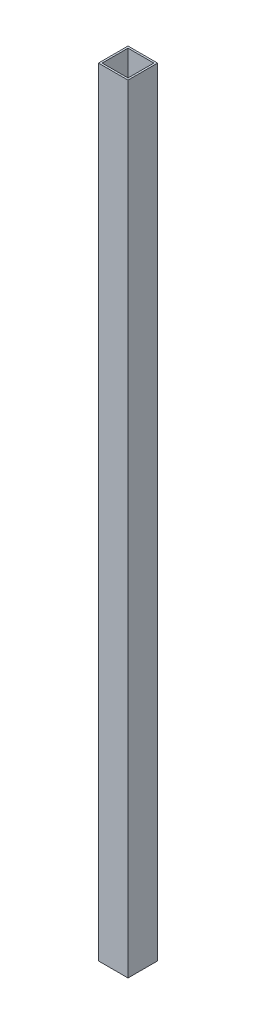
ISO-10303-21;
HEADER;
FILE_DESCRIPTION(('STEP AP214'),'2;1');
FILE_NAME('part.step','',(''),(''),'','','');
FILE_SCHEMA(('AUTOMOTIVE_DESIGN { 1 0 10303 214 1 1 1 1 }'));
ENDSEC;
DATA;
#1=APPLICATION_CONTEXT('core data for automotive mechanical design processes');
#2=APPLICATION_PROTOCOL_DEFINITION('international standard','automotive_design',2000,#1);
#3=PRODUCT_CONTEXT('',#1,'mechanical');
#4=PRODUCT('Part','Part','',(#3));
#5=PRODUCT_RELATED_PRODUCT_CATEGORY('part','',(#4));
#6=PRODUCT_DEFINITION_FORMATION('','',#4);
#7=PRODUCT_DEFINITION_CONTEXT('part definition',#1,'design');
#8=PRODUCT_DEFINITION('design','',#6,#7);
#9=PRODUCT_DEFINITION_SHAPE('','',#8);
#10=(LENGTH_UNIT() NAMED_UNIT(*) SI_UNIT(.MILLI.,.METRE.));
#11=(NAMED_UNIT(*) PLANE_ANGLE_UNIT() SI_UNIT($,.RADIAN.));
#12=(NAMED_UNIT(*) SI_UNIT($,.STERADIAN.) SOLID_ANGLE_UNIT());
#13=UNCERTAINTY_MEASURE_WITH_UNIT(LENGTH_MEASURE(1.E-05),#10,'distance_accuracy_value','');
#14=(GEOMETRIC_REPRESENTATION_CONTEXT(3) GLOBAL_UNCERTAINTY_ASSIGNED_CONTEXT((#13)) GLOBAL_UNIT_ASSIGNED_CONTEXT((#10,
#11,#12)) REPRESENTATION_CONTEXT('',''));
#15=CARTESIAN_POINT('',(0.,0.,0.));
#16=DIRECTION('',(0.,0.,1.));
#17=DIRECTION('',(1.,0.,0.));
#18=AXIS2_PLACEMENT_3D('',#15,#16,#17);
#19=CARTESIAN_POINT('',(0.,250.,0.));
#20=DIRECTION('',(0.,-1.,0.));
#21=DIRECTION('',(0.,0.,-1.));
#22=AXIS2_PLACEMENT_3D('',#19,#20,#21);
#23=PLANE('',#22);
#24=DIRECTION('',(0.,0.,-1.));
#25=VECTOR('',#24,1.);
#26=CARTESIAN_POINT('',(9.5,250.,9.5));
#27=LINE('',#26,#25);
#28=CARTESIAN_POINT('',(9.5,250.,9.5));
#29=VERTEX_POINT('',#28);
#30=CARTESIAN_POINT('',(9.5,250.,-9.5));
#31=VERTEX_POINT('',#30);
#32=EDGE_CURVE('E138',#29,#31,#27,.T.);
#33=ORIENTED_EDGE('',*,*,#32,.T.);
#34=DIRECTION('',(-1.,0.,0.));
#35=VECTOR('',#34,1.);
#36=CARTESIAN_POINT('',(-9.5,250.,-9.5));
#37=LINE('',#36,#35);
#38=CARTESIAN_POINT('',(-9.5,250.,-9.5));
#39=VERTEX_POINT('',#38);
#40=EDGE_CURVE('E141',#31,#39,#37,.T.);
#41=ORIENTED_EDGE('',*,*,#40,.T.);
#42=DIRECTION('',(0.,0.,1.));
#43=VECTOR('',#42,1.);
#44=CARTESIAN_POINT('',(-9.5,250.,9.5));
#45=LINE('',#44,#43);
#46=CARTESIAN_POINT('',(-9.5,250.,9.5));
#47=VERTEX_POINT('',#46);
#48=EDGE_CURVE('E144',#39,#47,#45,.T.);
#49=ORIENTED_EDGE('',*,*,#48,.T.);
#50=DIRECTION('',(1.,0.,0.));
#51=VECTOR('',#50,1.);
#52=CARTESIAN_POINT('',(-9.5,250.,9.5));
#53=LINE('',#52,#51);
#54=EDGE_CURVE('E146',#47,#29,#53,.T.);
#55=ORIENTED_EDGE('',*,*,#54,.T.);
#56=EDGE_LOOP('',(#33,#41,#49,#55));
#57=FACE_BOUND('',#56,.T.);
#58=DIRECTION('',(0.,0.,1.));
#59=VECTOR('',#58,1.);
#60=CARTESIAN_POINT('',(-8.3,250.,8.3));
#61=LINE('',#60,#59);
#62=CARTESIAN_POINT('',(-8.3,250.,-8.3));
#63=VERTEX_POINT('',#62);
#64=CARTESIAN_POINT('',(-8.3,250.,8.3));
#65=VERTEX_POINT('',#64);
#66=EDGE_CURVE('E102',#63,#65,#61,.T.);
#67=ORIENTED_EDGE('',*,*,#66,.F.);
#68=DIRECTION('',(-1.,0.,0.));
#69=VECTOR('',#68,1.);
#70=CARTESIAN_POINT('',(-8.3,250.,-8.3));
#71=LINE('',#70,#69);
#72=CARTESIAN_POINT('',(8.3,250.,-8.3));
#73=VERTEX_POINT('',#72);
#74=EDGE_CURVE('E124',#73,#63,#71,.T.);
#75=ORIENTED_EDGE('',*,*,#74,.F.);
#76=DIRECTION('',(0.,0.,-1.));
#77=VECTOR('',#76,1.);
#78=CARTESIAN_POINT('',(8.3,250.,8.3));
#79=LINE('',#78,#77);
#80=CARTESIAN_POINT('',(8.3,250.,8.3));
#81=VERTEX_POINT('',#80);
#82=EDGE_CURVE('E122',#81,#73,#79,.T.);
#83=ORIENTED_EDGE('',*,*,#82,.F.);
#84=DIRECTION('',(1.,0.,0.));
#85=VECTOR('',#84,1.);
#86=CARTESIAN_POINT('',(-8.3,250.,8.3));
#87=LINE('',#86,#85);
#88=EDGE_CURVE('E110',#65,#81,#87,.T.);
#89=ORIENTED_EDGE('',*,*,#88,.F.);
#90=EDGE_LOOP('',(#67,#75,#83,#89));
#91=FACE_BOUND('',#90,.T.);
#92=ADVANCED_FACE('F37',(#57,#91),#23,.F.);
#93=CARTESIAN_POINT('',(0.,-250.,0.));
#94=DIRECTION('',(0.,-1.,0.));
#95=DIRECTION('',(0.,0.,-1.));
#96=AXIS2_PLACEMENT_3D('',#93,#94,#95);
#97=PLANE('',#96);
#98=DIRECTION('',(0.,0.,-1.));
#99=VECTOR('',#98,1.);
#100=CARTESIAN_POINT('',(9.5,-250.,9.5));
#101=LINE('',#100,#99);
#102=CARTESIAN_POINT('',(9.5,-250.,9.5));
#103=VERTEX_POINT('',#102);
#104=CARTESIAN_POINT('',(9.5,-250.,-9.5));
#105=VERTEX_POINT('',#104);
#106=EDGE_CURVE('E118',#103,#105,#101,.T.);
#107=ORIENTED_EDGE('',*,*,#106,.F.);
#108=DIRECTION('',(1.,0.,0.));
#109=VECTOR('',#108,1.);
#110=CARTESIAN_POINT('',(-9.5,-250.,9.5));
#111=LINE('',#110,#109);
#112=CARTESIAN_POINT('',(-9.5,-250.,9.5));
#113=VERTEX_POINT('',#112);
#114=EDGE_CURVE('E142',#113,#103,#111,.T.);
#115=ORIENTED_EDGE('',*,*,#114,.F.);
#116=DIRECTION('',(0.,0.,1.));
#117=VECTOR('',#116,1.);
#118=CARTESIAN_POINT('',(-9.5,-250.,9.5));
#119=LINE('',#118,#117);
#120=CARTESIAN_POINT('',(-9.5,-250.,-9.5));
#121=VERTEX_POINT('',#120);
#122=EDGE_CURVE('E153',#121,#113,#119,.T.);
#123=ORIENTED_EDGE('',*,*,#122,.F.);
#124=DIRECTION('',(-1.,0.,0.));
#125=VECTOR('',#124,1.);
#126=CARTESIAN_POINT('',(-9.5,-250.,-9.5));
#127=LINE('',#126,#125);
#128=EDGE_CURVE('E151',#105,#121,#127,.T.);
#129=ORIENTED_EDGE('',*,*,#128,.F.);
#130=EDGE_LOOP('',(#107,#115,#123,#129));
#131=FACE_BOUND('',#130,.T.);
#132=DIRECTION('',(-1.,0.,0.));
#133=VECTOR('',#132,1.);
#134=CARTESIAN_POINT('',(-8.3,-250.,-8.3));
#135=LINE('',#134,#133);
#136=CARTESIAN_POINT('',(8.3,-250.,-8.3));
#137=VERTEX_POINT('',#136);
#138=CARTESIAN_POINT('',(-8.3,-250.,-8.3));
#139=VERTEX_POINT('',#138);
#140=EDGE_CURVE('E111',#137,#139,#135,.T.);
#141=ORIENTED_EDGE('',*,*,#140,.T.);
#142=DIRECTION('',(0.,0.,1.));
#143=VECTOR('',#142,1.);
#144=CARTESIAN_POINT('',(-8.3,-250.,8.3));
#145=LINE('',#144,#143);
#146=CARTESIAN_POINT('',(-8.3,-250.,8.3));
#147=VERTEX_POINT('',#146);
#148=EDGE_CURVE('E60',#139,#147,#145,.T.);
#149=ORIENTED_EDGE('',*,*,#148,.T.);
#150=DIRECTION('',(1.,0.,0.));
#151=VECTOR('',#150,1.);
#152=CARTESIAN_POINT('',(-8.3,-250.,8.3));
#153=LINE('',#152,#151);
#154=CARTESIAN_POINT('',(8.3,-250.,8.3));
#155=VERTEX_POINT('',#154);
#156=EDGE_CURVE('E117',#147,#155,#153,.T.);
#157=ORIENTED_EDGE('',*,*,#156,.T.);
#158=DIRECTION('',(0.,0.,-1.));
#159=VECTOR('',#158,1.);
#160=CARTESIAN_POINT('',(8.3,-250.,8.3));
#161=LINE('',#160,#159);
#162=EDGE_CURVE('E130',#155,#137,#161,.T.);
#163=ORIENTED_EDGE('',*,*,#162,.T.);
#164=EDGE_LOOP('',(#141,#149,#157,#163));
#165=FACE_BOUND('',#164,.T.);
#166=ADVANCED_FACE('F171',(#131,#165),#97,.T.);
#167=CARTESIAN_POINT('',(9.5,250.,9.5));
#168=DIRECTION('',(-1.,0.,0.));
#169=DIRECTION('',(0.,0.,1.));
#170=AXIS2_PLACEMENT_3D('',#167,#168,#169);
#171=PLANE('',#170);
#172=ORIENTED_EDGE('',*,*,#106,.T.);
#173=DIRECTION('',(0.,-1.,0.));
#174=VECTOR('',#173,1.);
#175=CARTESIAN_POINT('',(9.5,250.,-9.5));
#176=LINE('',#175,#174);
#177=EDGE_CURVE('E11',#31,#105,#176,.T.);
#178=ORIENTED_EDGE('',*,*,#177,.F.);
#179=ORIENTED_EDGE('',*,*,#32,.F.);
#180=DIRECTION('',(0.,-1.,0.));
#181=VECTOR('',#180,1.);
#182=CARTESIAN_POINT('',(9.5,250.,9.5));
#183=LINE('',#182,#181);
#184=EDGE_CURVE('E148',#29,#103,#183,.T.);
#185=ORIENTED_EDGE('',*,*,#184,.T.);
#186=EDGE_LOOP('',(#172,#178,#179,#185));
#187=FACE_BOUND('',#186,.T.);
#188=ADVANCED_FACE('F39',(#187),#171,.F.);
#189=CARTESIAN_POINT('',(-9.5,250.,-9.5));
#190=DIRECTION('',(0.,0.,1.));
#191=DIRECTION('',(1.,0.,0.));
#192=AXIS2_PLACEMENT_3D('',#189,#190,#191);
#193=PLANE('',#192);
#194=ORIENTED_EDGE('',*,*,#128,.T.);
#195=DIRECTION('',(0.,-1.,0.));
#196=VECTOR('',#195,1.);
#197=CARTESIAN_POINT('',(-9.5,250.,-9.5));
#198=LINE('',#197,#196);
#199=EDGE_CURVE('E45',#39,#121,#198,.T.);
#200=ORIENTED_EDGE('',*,*,#199,.F.);
#201=ORIENTED_EDGE('',*,*,#40,.F.);
#202=ORIENTED_EDGE('',*,*,#177,.T.);
#203=EDGE_LOOP('',(#194,#200,#201,#202));
#204=FACE_BOUND('',#203,.T.);
#205=ADVANCED_FACE('F181',(#204),#193,.F.);
#206=CARTESIAN_POINT('',(-9.5,250.,9.5));
#207=DIRECTION('',(1.,0.,0.));
#208=DIRECTION('',(0.,0.,-1.));
#209=AXIS2_PLACEMENT_3D('',#206,#207,#208);
#210=PLANE('',#209);
#211=ORIENTED_EDGE('',*,*,#122,.T.);
#212=DIRECTION('',(0.,-1.,0.));
#213=VECTOR('',#212,1.);
#214=CARTESIAN_POINT('',(-9.5,250.,9.5));
#215=LINE('',#214,#213);
#216=EDGE_CURVE('E158',#47,#113,#215,.T.);
#217=ORIENTED_EDGE('',*,*,#216,.F.);
#218=ORIENTED_EDGE('',*,*,#48,.F.);
#219=ORIENTED_EDGE('',*,*,#199,.T.);
#220=EDGE_LOOP('',(#211,#217,#218,#219));
#221=FACE_BOUND('',#220,.T.);
#222=ADVANCED_FACE('F165',(#221),#210,.F.);
#223=CARTESIAN_POINT('',(-9.5,250.,9.5));
#224=DIRECTION('',(0.,0.,-1.));
#225=DIRECTION('',(-1.,0.,0.));
#226=AXIS2_PLACEMENT_3D('',#223,#224,#225);
#227=PLANE('',#226);
#228=ORIENTED_EDGE('',*,*,#114,.T.);
#229=ORIENTED_EDGE('',*,*,#184,.F.);
#230=ORIENTED_EDGE('',*,*,#54,.F.);
#231=ORIENTED_EDGE('',*,*,#216,.T.);
#232=EDGE_LOOP('',(#228,#229,#230,#231));
#233=FACE_BOUND('',#232,.T.);
#234=ADVANCED_FACE('F175',(#233),#227,.F.);
#235=CARTESIAN_POINT('',(-8.3,250.,8.3));
#236=DIRECTION('',(1.,0.,0.));
#237=DIRECTION('',(0.,0.,-1.));
#238=AXIS2_PLACEMENT_3D('',#235,#236,#237);
#239=PLANE('',#238);
#240=ORIENTED_EDGE('',*,*,#148,.F.);
#241=DIRECTION('',(0.,-1.,0.));
#242=VECTOR('',#241,1.);
#243=CARTESIAN_POINT('',(-8.3,250.,-8.3));
#244=LINE('',#243,#242);
#245=EDGE_CURVE('E106',#63,#139,#244,.T.);
#246=ORIENTED_EDGE('',*,*,#245,.F.);
#247=ORIENTED_EDGE('',*,*,#66,.T.);
#248=DIRECTION('',(0.,-1.,0.));
#249=VECTOR('',#248,1.);
#250=CARTESIAN_POINT('',(-8.3,250.,8.3));
#251=LINE('',#250,#249);
#252=EDGE_CURVE('E105',#65,#147,#251,.T.);
#253=ORIENTED_EDGE('',*,*,#252,.T.);
#254=EDGE_LOOP('',(#240,#246,#247,#253));
#255=FACE_BOUND('',#254,.T.);
#256=ADVANCED_FACE('F104',(#255),#239,.T.);
#257=CARTESIAN_POINT('',(-8.3,250.,8.3));
#258=DIRECTION('',(0.,0.,-1.));
#259=DIRECTION('',(-1.,0.,0.));
#260=AXIS2_PLACEMENT_3D('',#257,#258,#259);
#261=PLANE('',#260);
#262=ORIENTED_EDGE('',*,*,#156,.F.);
#263=ORIENTED_EDGE('',*,*,#252,.F.);
#264=ORIENTED_EDGE('',*,*,#88,.T.);
#265=DIRECTION('',(0.,-1.,0.));
#266=VECTOR('',#265,1.);
#267=CARTESIAN_POINT('',(8.3,250.,8.3));
#268=LINE('',#267,#266);
#269=EDGE_CURVE('E119',#81,#155,#268,.T.);
#270=ORIENTED_EDGE('',*,*,#269,.T.);
#271=EDGE_LOOP('',(#262,#263,#264,#270));
#272=FACE_BOUND('',#271,.T.);
#273=ADVANCED_FACE('F114',(#272),#261,.T.);
#274=CARTESIAN_POINT('',(8.3,250.,8.3));
#275=DIRECTION('',(-1.,0.,0.));
#276=DIRECTION('',(0.,0.,1.));
#277=AXIS2_PLACEMENT_3D('',#274,#275,#276);
#278=PLANE('',#277);
#279=ORIENTED_EDGE('',*,*,#162,.F.);
#280=ORIENTED_EDGE('',*,*,#269,.F.);
#281=ORIENTED_EDGE('',*,*,#82,.T.);
#282=DIRECTION('',(0.,-1.,0.));
#283=VECTOR('',#282,1.);
#284=CARTESIAN_POINT('',(8.3,250.,-8.3));
#285=LINE('',#284,#283);
#286=EDGE_CURVE('E52',#73,#137,#285,.T.);
#287=ORIENTED_EDGE('',*,*,#286,.T.);
#288=EDGE_LOOP('',(#279,#280,#281,#287));
#289=FACE_BOUND('',#288,.T.);
#290=ADVANCED_FACE('F204',(#289),#278,.T.);
#291=CARTESIAN_POINT('',(-8.3,250.,-8.3));
#292=DIRECTION('',(0.,0.,1.));
#293=DIRECTION('',(1.,0.,0.));
#294=AXIS2_PLACEMENT_3D('',#291,#292,#293);
#295=PLANE('',#294);
#296=ORIENTED_EDGE('',*,*,#140,.F.);
#297=ORIENTED_EDGE('',*,*,#286,.F.);
#298=ORIENTED_EDGE('',*,*,#74,.T.);
#299=ORIENTED_EDGE('',*,*,#245,.T.);
#300=EDGE_LOOP('',(#296,#297,#298,#299));
#301=FACE_BOUND('',#300,.T.);
#302=ADVANCED_FACE('F208',(#301),#295,.T.);
#303=CLOSED_SHELL('',(#92,#166,#188,#205,#222,#234,#256,#273,#290,#302));
#304=MANIFOLD_SOLID_BREP('B2',#303);
#305=ADVANCED_BREP_SHAPE_REPRESENTATION('',(#18,#304),#14);
#306=SHAPE_DEFINITION_REPRESENTATION(#9,#305);
ENDSEC;
END-ISO-10303-21;
